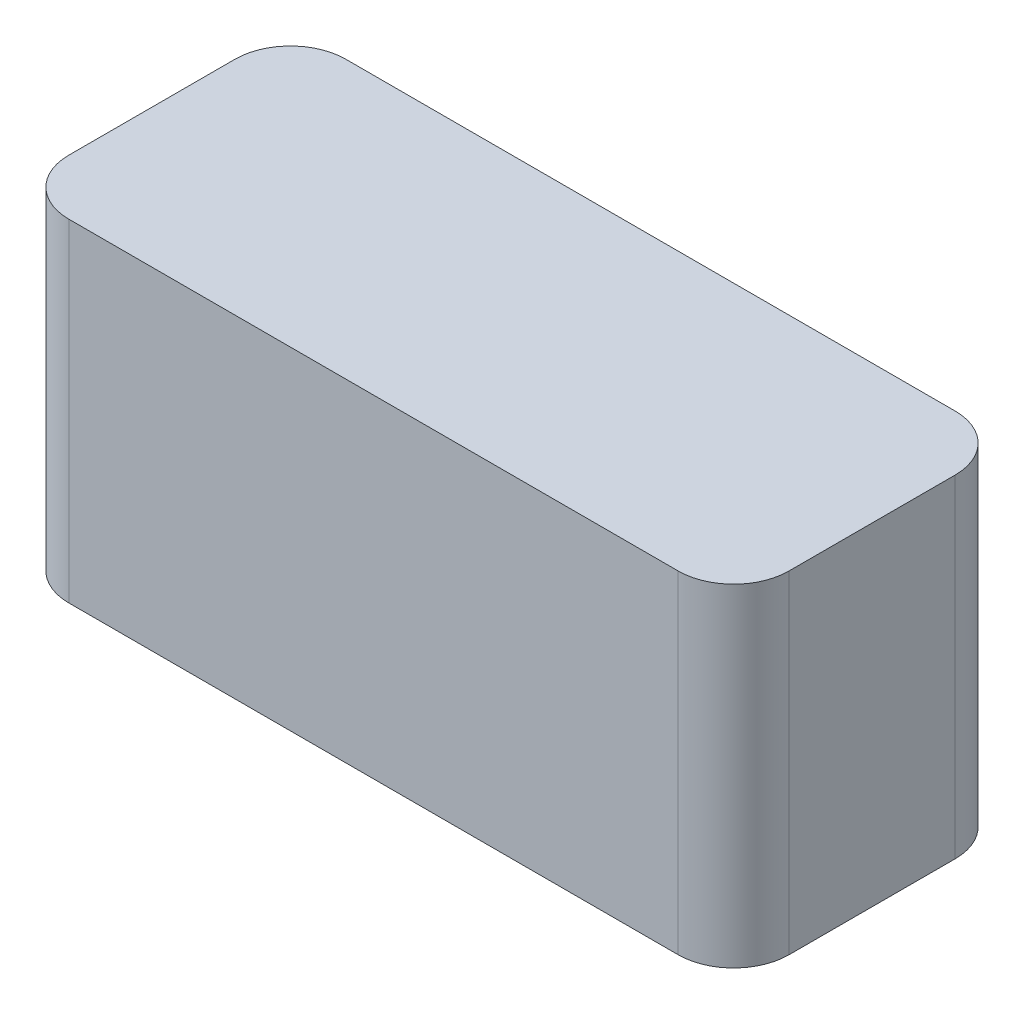
ISO-10303-21;
HEADER;
FILE_DESCRIPTION(('STEP AP214'),'2;1');
FILE_NAME('part.step','',(''),(''),'','','');
FILE_SCHEMA(('AUTOMOTIVE_DESIGN { 1 0 10303 214 1 1 1 1 }'));
ENDSEC;
DATA;
#1=APPLICATION_CONTEXT('core data for automotive mechanical design processes');
#2=APPLICATION_PROTOCOL_DEFINITION('international standard','automotive_design',2000,#1);
#3=PRODUCT_CONTEXT('',#1,'mechanical');
#4=PRODUCT('Part','Part','',(#3));
#5=PRODUCT_RELATED_PRODUCT_CATEGORY('part','',(#4));
#6=PRODUCT_DEFINITION_FORMATION('','',#4);
#7=PRODUCT_DEFINITION_CONTEXT('part definition',#1,'design');
#8=PRODUCT_DEFINITION('design','',#6,#7);
#9=PRODUCT_DEFINITION_SHAPE('','',#8);
#10=(LENGTH_UNIT() NAMED_UNIT(*) SI_UNIT(.MILLI.,.METRE.));
#11=(NAMED_UNIT(*) PLANE_ANGLE_UNIT() SI_UNIT($,.RADIAN.));
#12=(NAMED_UNIT(*) SI_UNIT($,.STERADIAN.) SOLID_ANGLE_UNIT());
#13=UNCERTAINTY_MEASURE_WITH_UNIT(LENGTH_MEASURE(1.E-05),#10,'distance_accuracy_value','');
#14=(GEOMETRIC_REPRESENTATION_CONTEXT(3) GLOBAL_UNCERTAINTY_ASSIGNED_CONTEXT((#13)) GLOBAL_UNIT_ASSIGNED_CONTEXT((#10,
#11,#12)) REPRESENTATION_CONTEXT('',''));
#15=CARTESIAN_POINT('',(0.,0.,0.));
#16=DIRECTION('',(0.,0.,1.));
#17=DIRECTION('',(1.,0.,0.));
#18=AXIS2_PLACEMENT_3D('',#15,#16,#17);
#19=CARTESIAN_POINT('',(32.5,30.,12.5));
#20=DIRECTION('',(-1.,0.,0.));
#21=DIRECTION('',(0.,0.,1.));
#22=AXIS2_PLACEMENT_3D('',#19,#20,#21);
#23=PLANE('',#22);
#24=DIRECTION('',(0.,0.,-1.));
#25=VECTOR('',#24,1.);
#26=CARTESIAN_POINT('',(32.5,0.,12.5));
#27=LINE('',#26,#25);
#28=CARTESIAN_POINT('',(32.5,0.,7.5));
#29=VERTEX_POINT('',#28);
#30=CARTESIAN_POINT('',(32.5,0.,-7.5));
#31=VERTEX_POINT('',#30);
#32=EDGE_CURVE('E140',#29,#31,#27,.T.);
#33=ORIENTED_EDGE('',*,*,#32,.T.);
#34=DIRECTION('',(0.,-1.,0.));
#35=VECTOR('',#34,1.);
#36=CARTESIAN_POINT('',(32.5,30.,-7.5));
#37=LINE('',#36,#35);
#38=CARTESIAN_POINT('',(32.5,30.,-7.5));
#39=VERTEX_POINT('',#38);
#40=EDGE_CURVE('E174',#31,#39,#37,.F.);
#41=ORIENTED_EDGE('',*,*,#40,.T.);
#42=DIRECTION('',(0.,0.,-1.));
#43=VECTOR('',#42,1.);
#44=CARTESIAN_POINT('',(32.5,30.,12.5));
#45=LINE('',#44,#43);
#46=CARTESIAN_POINT('',(32.5,30.,7.5));
#47=VERTEX_POINT('',#46);
#48=EDGE_CURVE('E138',#47,#39,#45,.T.);
#49=ORIENTED_EDGE('',*,*,#48,.F.);
#50=DIRECTION('',(0.,-1.,0.));
#51=VECTOR('',#50,1.);
#52=CARTESIAN_POINT('',(32.5,30.,7.5));
#53=LINE('',#52,#51);
#54=EDGE_CURVE('E170',#47,#29,#53,.T.);
#55=ORIENTED_EDGE('',*,*,#54,.T.);
#56=EDGE_LOOP('',(#33,#41,#49,#55));
#57=FACE_BOUND('',#56,.T.);
#58=ADVANCED_FACE('F39',(#57),#23,.F.);
#59=CARTESIAN_POINT('',(-32.5,30.,-12.5));
#60=DIRECTION('',(0.,0.,1.));
#61=DIRECTION('',(1.,0.,0.));
#62=AXIS2_PLACEMENT_3D('',#59,#60,#61);
#63=PLANE('',#62);
#64=DIRECTION('',(-1.,0.,0.));
#65=VECTOR('',#64,1.);
#66=CARTESIAN_POINT('',(-32.5,0.,-12.5));
#67=LINE('',#66,#65);
#68=CARTESIAN_POINT('',(27.5,0.,-12.5));
#69=VERTEX_POINT('',#68);
#70=CARTESIAN_POINT('',(-27.5,0.,-12.5));
#71=VERTEX_POINT('',#70);
#72=EDGE_CURVE('E134',#69,#71,#67,.T.);
#73=ORIENTED_EDGE('',*,*,#72,.T.);
#74=DIRECTION('',(0.,-1.,0.));
#75=VECTOR('',#74,1.);
#76=CARTESIAN_POINT('',(-27.5,30.,-12.5));
#77=LINE('',#76,#75);
#78=CARTESIAN_POINT('',(-27.5,30.,-12.5));
#79=VERTEX_POINT('',#78);
#80=EDGE_CURVE('E110',#71,#79,#77,.F.);
#81=ORIENTED_EDGE('',*,*,#80,.T.);
#82=DIRECTION('',(-1.,0.,0.));
#83=VECTOR('',#82,1.);
#84=CARTESIAN_POINT('',(-32.5,30.,-12.5));
#85=LINE('',#84,#83);
#86=CARTESIAN_POINT('',(27.5,30.,-12.5));
#87=VERTEX_POINT('',#86);
#88=EDGE_CURVE('E193',#87,#79,#85,.T.);
#89=ORIENTED_EDGE('',*,*,#88,.F.);
#90=DIRECTION('',(0.,-1.,0.));
#91=VECTOR('',#90,1.);
#92=CARTESIAN_POINT('',(27.5,30.,-12.5));
#93=LINE('',#92,#91);
#94=EDGE_CURVE('E116',#87,#69,#93,.T.);
#95=ORIENTED_EDGE('',*,*,#94,.T.);
#96=EDGE_LOOP('',(#73,#81,#89,#95));
#97=FACE_BOUND('',#96,.T.);
#98=ADVANCED_FACE('F214',(#97),#63,.F.);
#99=CARTESIAN_POINT('',(-32.5,30.,12.5));
#100=DIRECTION('',(1.,0.,0.));
#101=DIRECTION('',(0.,0.,-1.));
#102=AXIS2_PLACEMENT_3D('',#99,#100,#101);
#103=PLANE('',#102);
#104=DIRECTION('',(0.,0.,1.));
#105=VECTOR('',#104,1.);
#106=CARTESIAN_POINT('',(-32.5,30.,12.5));
#107=LINE('',#106,#105);
#108=CARTESIAN_POINT('',(-32.5,30.,-7.5));
#109=VERTEX_POINT('',#108);
#110=CARTESIAN_POINT('',(-32.5,30.,7.5));
#111=VERTEX_POINT('',#110);
#112=EDGE_CURVE('E125',#109,#111,#107,.T.);
#113=ORIENTED_EDGE('',*,*,#112,.F.);
#114=DIRECTION('',(0.,-1.,0.));
#115=VECTOR('',#114,1.);
#116=CARTESIAN_POINT('',(-32.5,30.,-7.5));
#117=LINE('',#116,#115);
#118=CARTESIAN_POINT('',(-32.5,0.,-7.5));
#119=VERTEX_POINT('',#118);
#120=EDGE_CURVE('E109',#109,#119,#117,.T.);
#121=ORIENTED_EDGE('',*,*,#120,.T.);
#122=DIRECTION('',(0.,0.,1.));
#123=VECTOR('',#122,1.);
#124=CARTESIAN_POINT('',(-32.5,0.,12.5));
#125=LINE('',#124,#123);
#126=CARTESIAN_POINT('',(-32.5,0.,7.5));
#127=VERTEX_POINT('',#126);
#128=EDGE_CURVE('E123',#119,#127,#125,.T.);
#129=ORIENTED_EDGE('',*,*,#128,.T.);
#130=DIRECTION('',(0.,-1.,0.));
#131=VECTOR('',#130,1.);
#132=CARTESIAN_POINT('',(-32.5,30.,7.5));
#133=LINE('',#132,#131);
#134=EDGE_CURVE('E128',#127,#111,#133,.F.);
#135=ORIENTED_EDGE('',*,*,#134,.T.);
#136=EDGE_LOOP('',(#113,#121,#129,#135));
#137=FACE_BOUND('',#136,.T.);
#138=ADVANCED_FACE('F122',(#137),#103,.F.);
#139=CARTESIAN_POINT('',(-32.5,30.,12.5));
#140=DIRECTION('',(0.,0.,-1.));
#141=DIRECTION('',(-1.,0.,0.));
#142=AXIS2_PLACEMENT_3D('',#139,#140,#141);
#143=PLANE('',#142);
#144=DIRECTION('',(1.,0.,0.));
#145=VECTOR('',#144,1.);
#146=CARTESIAN_POINT('',(-32.5,0.,12.5));
#147=LINE('',#146,#145);
#148=CARTESIAN_POINT('',(-27.5,0.,12.5));
#149=VERTEX_POINT('',#148);
#150=CARTESIAN_POINT('',(27.5,0.,12.5));
#151=VERTEX_POINT('',#150);
#152=EDGE_CURVE('E133',#149,#151,#147,.T.);
#153=ORIENTED_EDGE('',*,*,#152,.T.);
#154=DIRECTION('',(0.,-1.,0.));
#155=VECTOR('',#154,1.);
#156=CARTESIAN_POINT('',(27.5,30.,12.5));
#157=LINE('',#156,#155);
#158=CARTESIAN_POINT('',(27.5,30.,12.5));
#159=VERTEX_POINT('',#158);
#160=EDGE_CURVE('E11',#151,#159,#157,.F.);
#161=ORIENTED_EDGE('',*,*,#160,.T.);
#162=DIRECTION('',(1.,0.,0.));
#163=VECTOR('',#162,1.);
#164=CARTESIAN_POINT('',(-32.5,30.,12.5));
#165=LINE('',#164,#163);
#166=CARTESIAN_POINT('',(-27.5,30.,12.5));
#167=VERTEX_POINT('',#166);
#168=EDGE_CURVE('E145',#167,#159,#165,.T.);
#169=ORIENTED_EDGE('',*,*,#168,.F.);
#170=DIRECTION('',(0.,-1.,0.));
#171=VECTOR('',#170,1.);
#172=CARTESIAN_POINT('',(-27.5,30.,12.5));
#173=LINE('',#172,#171);
#174=EDGE_CURVE('E48',#167,#149,#173,.T.);
#175=ORIENTED_EDGE('',*,*,#174,.T.);
#176=EDGE_LOOP('',(#153,#161,#169,#175));
#177=FACE_BOUND('',#176,.T.);
#178=ADVANCED_FACE('F179',(#177),#143,.F.);
#179=CARTESIAN_POINT('',(0.,30.,0.));
#180=DIRECTION('',(0.,-1.,0.));
#181=DIRECTION('',(0.,0.,-1.));
#182=AXIS2_PLACEMENT_3D('',#179,#180,#181);
#183=PLANE('',#182);
#184=ORIENTED_EDGE('',*,*,#88,.T.);
#185=CARTESIAN_POINT('',(-27.5,30.,-7.5));
#186=DIRECTION('',(0.,-1.,0.));
#187=DIRECTION('',(0.,0.,-1.));
#188=AXIS2_PLACEMENT_3D('',#185,#186,#187);
#189=CIRCLE('',#188,5.);
#190=EDGE_CURVE('E167',#79,#109,#189,.F.);
#191=ORIENTED_EDGE('',*,*,#190,.T.);
#192=ORIENTED_EDGE('',*,*,#112,.T.);
#193=CARTESIAN_POINT('',(-27.5,30.,7.5));
#194=DIRECTION('',(0.,-1.,0.));
#195=DIRECTION('',(0.,0.,-1.));
#196=AXIS2_PLACEMENT_3D('',#193,#194,#195);
#197=CIRCLE('',#196,5.);
#198=EDGE_CURVE('E60',#111,#167,#197,.F.);
#199=ORIENTED_EDGE('',*,*,#198,.T.);
#200=ORIENTED_EDGE('',*,*,#168,.T.);
#201=CARTESIAN_POINT('',(27.5,30.,7.5));
#202=DIRECTION('',(0.,-1.,0.));
#203=DIRECTION('',(0.,0.,-1.));
#204=AXIS2_PLACEMENT_3D('',#201,#202,#203);
#205=CIRCLE('',#204,5.);
#206=EDGE_CURVE('E161',#159,#47,#205,.F.);
#207=ORIENTED_EDGE('',*,*,#206,.T.);
#208=ORIENTED_EDGE('',*,*,#48,.T.);
#209=CARTESIAN_POINT('',(27.5,30.,-7.5));
#210=DIRECTION('',(0.,-1.,0.));
#211=DIRECTION('',(0.,0.,-1.));
#212=AXIS2_PLACEMENT_3D('',#209,#210,#211);
#213=CIRCLE('',#212,5.);
#214=EDGE_CURVE('E164',#39,#87,#213,.F.);
#215=ORIENTED_EDGE('',*,*,#214,.T.);
#216=EDGE_LOOP('',(#184,#191,#192,#199,#200,#207,#208,#215));
#217=FACE_BOUND('',#216,.T.);
#218=ADVANCED_FACE('F203',(#217),#183,.F.);
#219=CARTESIAN_POINT('',(0.,0.,0.));
#220=DIRECTION('',(0.,-1.,0.));
#221=DIRECTION('',(0.,0.,-1.));
#222=AXIS2_PLACEMENT_3D('',#219,#220,#221);
#223=PLANE('',#222);
#224=ORIENTED_EDGE('',*,*,#128,.F.);
#225=CARTESIAN_POINT('',(-27.5,0.,-7.5));
#226=DIRECTION('',(0.,-1.,0.));
#227=DIRECTION('',(0.,0.,-1.));
#228=AXIS2_PLACEMENT_3D('',#225,#226,#227);
#229=CIRCLE('',#228,5.);
#230=EDGE_CURVE('E105',#119,#71,#229,.T.);
#231=ORIENTED_EDGE('',*,*,#230,.T.);
#232=ORIENTED_EDGE('',*,*,#72,.F.);
#233=CARTESIAN_POINT('',(27.5,0.,-7.5));
#234=DIRECTION('',(0.,-1.,0.));
#235=DIRECTION('',(0.,0.,-1.));
#236=AXIS2_PLACEMENT_3D('',#233,#234,#235);
#237=CIRCLE('',#236,5.);
#238=EDGE_CURVE('E117',#69,#31,#237,.T.);
#239=ORIENTED_EDGE('',*,*,#238,.T.);
#240=ORIENTED_EDGE('',*,*,#32,.F.);
#241=CARTESIAN_POINT('',(27.5,0.,7.5));
#242=DIRECTION('',(0.,-1.,0.));
#243=DIRECTION('',(0.,0.,-1.));
#244=AXIS2_PLACEMENT_3D('',#241,#242,#243);
#245=CIRCLE('',#244,5.);
#246=EDGE_CURVE('E149',#29,#151,#245,.T.);
#247=ORIENTED_EDGE('',*,*,#246,.T.);
#248=ORIENTED_EDGE('',*,*,#152,.F.);
#249=CARTESIAN_POINT('',(-27.5,0.,7.5));
#250=DIRECTION('',(0.,-1.,0.));
#251=DIRECTION('',(0.,0.,-1.));
#252=AXIS2_PLACEMENT_3D('',#249,#250,#251);
#253=CIRCLE('',#252,5.);
#254=EDGE_CURVE('E127',#149,#127,#253,.T.);
#255=ORIENTED_EDGE('',*,*,#254,.T.);
#256=EDGE_LOOP('',(#224,#231,#232,#239,#240,#247,#248,#255));
#257=FACE_BOUND('',#256,.T.);
#258=ADVANCED_FACE('F130',(#257),#223,.T.);
#259=CARTESIAN_POINT('',(-27.5,30.,-7.5));
#260=DIRECTION('',(0.,-1.,0.));
#261=DIRECTION('',(0.,0.,-1.));
#262=AXIS2_PLACEMENT_3D('',#259,#260,#261);
#263=CYLINDRICAL_SURFACE('',#262,5.);
#264=ORIENTED_EDGE('',*,*,#190,.F.);
#265=ORIENTED_EDGE('',*,*,#80,.F.);
#266=ORIENTED_EDGE('',*,*,#230,.F.);
#267=ORIENTED_EDGE('',*,*,#120,.F.);
#268=EDGE_LOOP('',(#264,#265,#266,#267));
#269=FACE_BOUND('',#268,.T.);
#270=ADVANCED_FACE('F108',(#269),#263,.T.);
#271=CARTESIAN_POINT('',(27.5,30.,-7.5));
#272=DIRECTION('',(0.,-1.,0.));
#273=DIRECTION('',(0.,0.,-1.));
#274=AXIS2_PLACEMENT_3D('',#271,#272,#273);
#275=CYLINDRICAL_SURFACE('',#274,5.);
#276=ORIENTED_EDGE('',*,*,#214,.F.);
#277=ORIENTED_EDGE('',*,*,#40,.F.);
#278=ORIENTED_EDGE('',*,*,#238,.F.);
#279=ORIENTED_EDGE('',*,*,#94,.F.);
#280=EDGE_LOOP('',(#276,#277,#278,#279));
#281=FACE_BOUND('',#280,.T.);
#282=ADVANCED_FACE('F225',(#281),#275,.T.);
#283=CARTESIAN_POINT('',(27.5,30.,7.5));
#284=DIRECTION('',(0.,-1.,0.));
#285=DIRECTION('',(0.,0.,-1.));
#286=AXIS2_PLACEMENT_3D('',#283,#284,#285);
#287=CYLINDRICAL_SURFACE('',#286,5.);
#288=ORIENTED_EDGE('',*,*,#206,.F.);
#289=ORIENTED_EDGE('',*,*,#160,.F.);
#290=ORIENTED_EDGE('',*,*,#246,.F.);
#291=ORIENTED_EDGE('',*,*,#54,.F.);
#292=EDGE_LOOP('',(#288,#289,#290,#291));
#293=FACE_BOUND('',#292,.T.);
#294=ADVANCED_FACE('F186',(#293),#287,.T.);
#295=CARTESIAN_POINT('',(-27.5,30.,7.5));
#296=DIRECTION('',(0.,-1.,0.));
#297=DIRECTION('',(0.,0.,-1.));
#298=AXIS2_PLACEMENT_3D('',#295,#296,#297);
#299=CYLINDRICAL_SURFACE('',#298,5.);
#300=ORIENTED_EDGE('',*,*,#198,.F.);
#301=ORIENTED_EDGE('',*,*,#134,.F.);
#302=ORIENTED_EDGE('',*,*,#254,.F.);
#303=ORIENTED_EDGE('',*,*,#174,.F.);
#304=EDGE_LOOP('',(#300,#301,#302,#303));
#305=FACE_BOUND('',#304,.T.);
#306=ADVANCED_FACE('F41',(#305),#299,.T.);
#307=CLOSED_SHELL('',(#58,#98,#138,#178,#218,#258,#270,#282,#294,#306));
#308=MANIFOLD_SOLID_BREP('B2',#307);
#309=ADVANCED_BREP_SHAPE_REPRESENTATION('',(#18,#308),#14);
#310=SHAPE_DEFINITION_REPRESENTATION(#9,#309);
ENDSEC;
END-ISO-10303-21;
